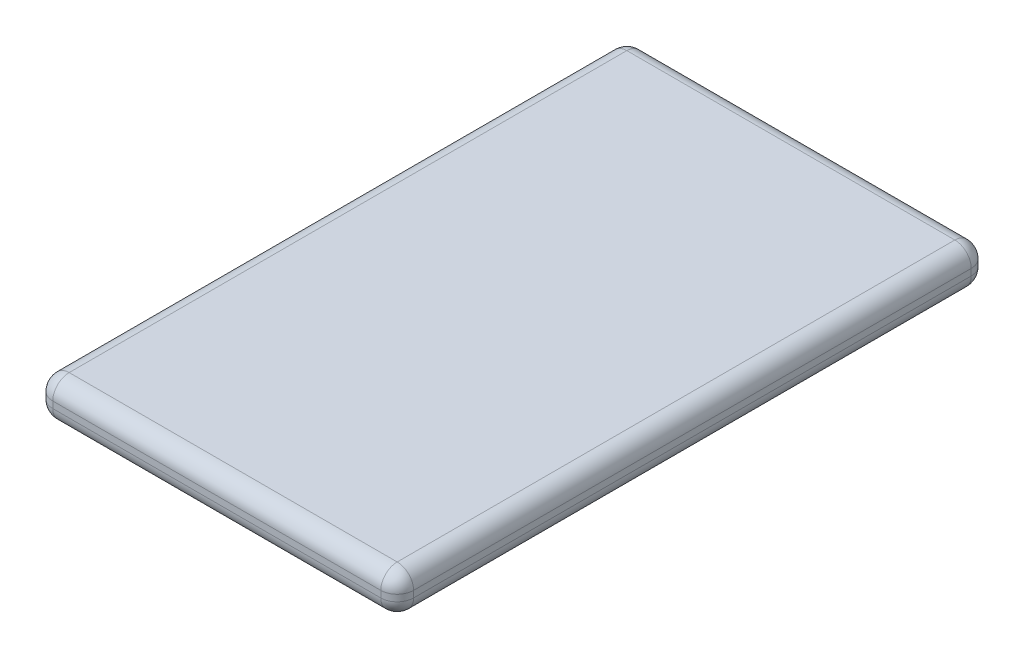
ISO-10303-21;
HEADER;
FILE_DESCRIPTION(('STEP AP214'),'2;1');
FILE_NAME('part.step','',(''),(''),'','','');
FILE_SCHEMA(('AUTOMOTIVE_DESIGN { 1 0 10303 214 1 1 1 1 }'));
ENDSEC;
DATA;
#1=APPLICATION_CONTEXT('core data for automotive mechanical design processes');
#2=APPLICATION_PROTOCOL_DEFINITION('international standard','automotive_design',2000,#1);
#3=PRODUCT_CONTEXT('',#1,'mechanical');
#4=PRODUCT('Part','Part','',(#3));
#5=PRODUCT_RELATED_PRODUCT_CATEGORY('part','',(#4));
#6=PRODUCT_DEFINITION_FORMATION('','',#4);
#7=PRODUCT_DEFINITION_CONTEXT('part definition',#1,'design');
#8=PRODUCT_DEFINITION('design','',#6,#7);
#9=PRODUCT_DEFINITION_SHAPE('','',#8);
#10=(LENGTH_UNIT() NAMED_UNIT(*) SI_UNIT(.MILLI.,.METRE.));
#11=(NAMED_UNIT(*) PLANE_ANGLE_UNIT() SI_UNIT($,.RADIAN.));
#12=(NAMED_UNIT(*) SI_UNIT($,.STERADIAN.) SOLID_ANGLE_UNIT());
#13=UNCERTAINTY_MEASURE_WITH_UNIT(LENGTH_MEASURE(1.E-05),#10,'distance_accuracy_value','');
#14=(GEOMETRIC_REPRESENTATION_CONTEXT(3) GLOBAL_UNCERTAINTY_ASSIGNED_CONTEXT((#13)) GLOBAL_UNIT_ASSIGNED_CONTEXT((#10,
#11,#12)) REPRESENTATION_CONTEXT('',''));
#15=CARTESIAN_POINT('',(0.,0.,0.));
#16=DIRECTION('',(0.,0.,1.));
#17=DIRECTION('',(1.,0.,0.));
#18=AXIS2_PLACEMENT_3D('',#15,#16,#17);
#19=CARTESIAN_POINT('',(0.,6.,0.));
#20=DIRECTION('',(1.,0.,0.));
#21=DIRECTION('',(0.,0.,-1.));
#22=AXIS2_PLACEMENT_3D('',#19,#20,#21);
#23=PLANE('',#22);
#24=DIRECTION('',(0.,-1.,0.));
#25=VECTOR('',#24,1.);
#26=CARTESIAN_POINT('',(0.,6.,2.5));
#27=LINE('',#26,#25);
#28=CARTESIAN_POINT('',(0.,3.5,2.5));
#29=VERTEX_POINT('',#28);
#30=CARTESIAN_POINT('',(0.,2.5,2.5));
#31=VERTEX_POINT('',#30);
#32=EDGE_CURVE('E133',#29,#31,#27,.T.);
#33=ORIENTED_EDGE('',*,*,#32,.T.);
#34=DIRECTION('',(0.,0.,1.));
#35=VECTOR('',#34,1.);
#36=CARTESIAN_POINT('',(0.,2.5,0.));
#37=LINE('',#36,#35);
#38=CARTESIAN_POINT('',(0.,2.5,87.5));
#39=VERTEX_POINT('',#38);
#40=EDGE_CURVE('E129',#31,#39,#37,.T.);
#41=ORIENTED_EDGE('',*,*,#40,.T.);
#42=DIRECTION('',(0.,-1.,0.));
#43=VECTOR('',#42,1.);
#44=CARTESIAN_POINT('',(0.,6.,87.5));
#45=LINE('',#44,#43);
#46=CARTESIAN_POINT('',(0.,3.5,87.5));
#47=VERTEX_POINT('',#46);
#48=EDGE_CURVE('E122',#39,#47,#45,.F.);
#49=ORIENTED_EDGE('',*,*,#48,.T.);
#50=DIRECTION('',(0.,0.,1.));
#51=VECTOR('',#50,1.);
#52=CARTESIAN_POINT('',(0.,3.5,0.));
#53=LINE('',#52,#51);
#54=EDGE_CURVE('E126',#47,#29,#53,.F.);
#55=ORIENTED_EDGE('',*,*,#54,.T.);
#56=EDGE_LOOP('',(#33,#41,#49,#55));
#57=FACE_BOUND('',#56,.T.);
#58=ADVANCED_FACE('F34',(#57),#23,.F.);
#59=CARTESIAN_POINT('',(0.,6.,90.));
#60=DIRECTION('',(0.,0.,-1.));
#61=DIRECTION('',(-1.,0.,0.));
#62=AXIS2_PLACEMENT_3D('',#59,#60,#61);
#63=PLANE('',#62);
#64=DIRECTION('',(0.,-1.,0.));
#65=VECTOR('',#64,1.);
#66=CARTESIAN_POINT('',(2.50000000000001,6.,90.));
#67=LINE('',#66,#65);
#68=CARTESIAN_POINT('',(2.50000000000001,3.5,90.));
#69=VERTEX_POINT('',#68);
#70=CARTESIAN_POINT('',(2.50000000000001,2.5,90.));
#71=VERTEX_POINT('',#70);
#72=EDGE_CURVE('E141',#69,#71,#67,.T.);
#73=ORIENTED_EDGE('',*,*,#72,.T.);
#74=DIRECTION('',(1.,0.,0.));
#75=VECTOR('',#74,1.);
#76=CARTESIAN_POINT('',(0.,2.5,90.));
#77=LINE('',#76,#75);
#78=CARTESIAN_POINT('',(52.5,2.5,90.));
#79=VERTEX_POINT('',#78);
#80=EDGE_CURVE('E179',#71,#79,#77,.T.);
#81=ORIENTED_EDGE('',*,*,#80,.T.);
#82=DIRECTION('',(0.,-1.,0.));
#83=VECTOR('',#82,1.);
#84=CARTESIAN_POINT('',(52.5,6.,90.));
#85=LINE('',#84,#83);
#86=CARTESIAN_POINT('',(52.5,3.5,90.));
#87=VERTEX_POINT('',#86);
#88=EDGE_CURVE('E176',#79,#87,#85,.F.);
#89=ORIENTED_EDGE('',*,*,#88,.T.);
#90=DIRECTION('',(1.,0.,0.));
#91=VECTOR('',#90,1.);
#92=CARTESIAN_POINT('',(0.,3.5,90.));
#93=LINE('',#92,#91);
#94=EDGE_CURVE('E174',#87,#69,#93,.F.);
#95=ORIENTED_EDGE('',*,*,#94,.T.);
#96=EDGE_LOOP('',(#73,#81,#89,#95));
#97=FACE_BOUND('',#96,.T.);
#98=ADVANCED_FACE('F296',(#97),#63,.F.);
#99=CARTESIAN_POINT('',(55.,6.,0.));
#100=DIRECTION('',(-1.,0.,0.));
#101=DIRECTION('',(0.,0.,1.));
#102=AXIS2_PLACEMENT_3D('',#99,#100,#101);
#103=PLANE('',#102);
#104=DIRECTION('',(0.,-1.,0.));
#105=VECTOR('',#104,1.);
#106=CARTESIAN_POINT('',(55.,6.,87.5));
#107=LINE('',#106,#105);
#108=CARTESIAN_POINT('',(55.,3.5,87.5));
#109=VERTEX_POINT('',#108);
#110=CARTESIAN_POINT('',(55.,2.5,87.5));
#111=VERTEX_POINT('',#110);
#112=EDGE_CURVE('E185',#109,#111,#107,.T.);
#113=ORIENTED_EDGE('',*,*,#112,.T.);
#114=DIRECTION('',(0.,0.,-1.));
#115=VECTOR('',#114,1.);
#116=CARTESIAN_POINT('',(55.,2.5,0.));
#117=LINE('',#116,#115);
#118=CARTESIAN_POINT('',(55.,2.5,2.5));
#119=VERTEX_POINT('',#118);
#120=EDGE_CURVE('E188',#111,#119,#117,.T.);
#121=ORIENTED_EDGE('',*,*,#120,.T.);
#122=DIRECTION('',(0.,-1.,0.));
#123=VECTOR('',#122,1.);
#124=CARTESIAN_POINT('',(55.,6.,2.5));
#125=LINE('',#124,#123);
#126=CARTESIAN_POINT('',(55.,3.5,2.5));
#127=VERTEX_POINT('',#126);
#128=EDGE_CURVE('E183',#119,#127,#125,.F.);
#129=ORIENTED_EDGE('',*,*,#128,.T.);
#130=DIRECTION('',(0.,0.,-1.));
#131=VECTOR('',#130,1.);
#132=CARTESIAN_POINT('',(55.,3.5,90.));
#133=LINE('',#132,#131);
#134=EDGE_CURVE('E181',#127,#109,#133,.F.);
#135=ORIENTED_EDGE('',*,*,#134,.T.);
#136=EDGE_LOOP('',(#113,#121,#129,#135));
#137=FACE_BOUND('',#136,.T.);
#138=ADVANCED_FACE('F273',(#137),#103,.F.);
#139=CARTESIAN_POINT('',(0.,6.,0.));
#140=DIRECTION('',(0.,0.,1.));
#141=DIRECTION('',(1.,0.,0.));
#142=AXIS2_PLACEMENT_3D('',#139,#140,#141);
#143=PLANE('',#142);
#144=DIRECTION('',(0.,-1.,0.));
#145=VECTOR('',#144,1.);
#146=CARTESIAN_POINT('',(52.5,6.,0.));
#147=LINE('',#146,#145);
#148=CARTESIAN_POINT('',(52.5,3.5,0.));
#149=VERTEX_POINT('',#148);
#150=CARTESIAN_POINT('',(52.5,2.5,0.));
#151=VERTEX_POINT('',#150);
#152=EDGE_CURVE('E167',#149,#151,#147,.T.);
#153=ORIENTED_EDGE('',*,*,#152,.T.);
#154=DIRECTION('',(-1.,0.,0.));
#155=VECTOR('',#154,1.);
#156=CARTESIAN_POINT('',(0.,2.5,0.));
#157=LINE('',#156,#155);
#158=CARTESIAN_POINT('',(2.5,2.5,0.));
#159=VERTEX_POINT('',#158);
#160=EDGE_CURVE('E172',#151,#159,#157,.T.);
#161=ORIENTED_EDGE('',*,*,#160,.T.);
#162=DIRECTION('',(0.,-1.,0.));
#163=VECTOR('',#162,1.);
#164=CARTESIAN_POINT('',(2.5,6.,0.));
#165=LINE('',#164,#163);
#166=CARTESIAN_POINT('',(2.5,3.5,0.));
#167=VERTEX_POINT('',#166);
#168=EDGE_CURVE('E169',#159,#167,#165,.F.);
#169=ORIENTED_EDGE('',*,*,#168,.T.);
#170=DIRECTION('',(-1.,0.,0.));
#171=VECTOR('',#170,1.);
#172=CARTESIAN_POINT('',(55.,3.5,0.));
#173=LINE('',#172,#171);
#174=EDGE_CURVE('E165',#167,#149,#173,.F.);
#175=ORIENTED_EDGE('',*,*,#174,.T.);
#176=EDGE_LOOP('',(#153,#161,#169,#175));
#177=FACE_BOUND('',#176,.T.);
#178=ADVANCED_FACE('F303',(#177),#143,.F.);
#179=CARTESIAN_POINT('',(0.,6.,0.));
#180=DIRECTION('',(0.,1.,0.));
#181=DIRECTION('',(0.,0.,1.));
#182=AXIS2_PLACEMENT_3D('',#179,#180,#181);
#183=PLANE('',#182);
#184=DIRECTION('',(0.,0.,-1.));
#185=VECTOR('',#184,1.);
#186=CARTESIAN_POINT('',(52.5,6.,0.));
#187=LINE('',#186,#185);
#188=CARTESIAN_POINT('',(52.5,6.,87.5));
#189=VERTEX_POINT('',#188);
#190=CARTESIAN_POINT('',(52.5,6.,2.5));
#191=VERTEX_POINT('',#190);
#192=EDGE_CURVE('E43',#189,#191,#187,.T.);
#193=ORIENTED_EDGE('',*,*,#192,.T.);
#194=DIRECTION('',(-1.,0.,0.));
#195=VECTOR('',#194,1.);
#196=CARTESIAN_POINT('',(0.,6.,2.5));
#197=LINE('',#196,#195);
#198=CARTESIAN_POINT('',(2.5,6.,2.5));
#199=VERTEX_POINT('',#198);
#200=EDGE_CURVE('E11',#191,#199,#197,.T.);
#201=ORIENTED_EDGE('',*,*,#200,.T.);
#202=DIRECTION('',(0.,0.,1.));
#203=VECTOR('',#202,1.);
#204=CARTESIAN_POINT('',(2.50000000000001,6.,90.));
#205=LINE('',#204,#203);
#206=CARTESIAN_POINT('',(2.50000000000001,6.,87.5));
#207=VERTEX_POINT('',#206);
#208=EDGE_CURVE('E199',#199,#207,#205,.T.);
#209=ORIENTED_EDGE('',*,*,#208,.T.);
#210=DIRECTION('',(1.,0.,0.));
#211=VECTOR('',#210,1.);
#212=CARTESIAN_POINT('',(55.,6.,87.5));
#213=LINE('',#212,#211);
#214=EDGE_CURVE('E54',#207,#189,#213,.T.);
#215=ORIENTED_EDGE('',*,*,#214,.T.);
#216=EDGE_LOOP('',(#193,#201,#209,#215));
#217=FACE_BOUND('',#216,.T.);
#218=ADVANCED_FACE('F366',(#217),#183,.T.);
#219=CARTESIAN_POINT('',(0.,0.,0.));
#220=DIRECTION('',(0.,1.,0.));
#221=DIRECTION('',(0.,0.,1.));
#222=AXIS2_PLACEMENT_3D('',#219,#220,#221);
#223=PLANE('',#222);
#224=DIRECTION('',(0.,0.,-1.));
#225=VECTOR('',#224,1.);
#226=CARTESIAN_POINT('',(52.5,0.,0.));
#227=LINE('',#226,#225);
#228=CARTESIAN_POINT('',(52.5,0.,2.5));
#229=VERTEX_POINT('',#228);
#230=CARTESIAN_POINT('',(52.5,0.,87.5));
#231=VERTEX_POINT('',#230);
#232=EDGE_CURVE('E194',#229,#231,#227,.F.);
#233=ORIENTED_EDGE('',*,*,#232,.T.);
#234=DIRECTION('',(1.,0.,0.));
#235=VECTOR('',#234,1.);
#236=CARTESIAN_POINT('',(0.,0.,87.5));
#237=LINE('',#236,#235);
#238=CARTESIAN_POINT('',(2.50000000000001,0.,87.5));
#239=VERTEX_POINT('',#238);
#240=EDGE_CURVE('E196',#231,#239,#237,.F.);
#241=ORIENTED_EDGE('',*,*,#240,.T.);
#242=DIRECTION('',(0.,0.,1.));
#243=VECTOR('',#242,1.);
#244=CARTESIAN_POINT('',(2.5,0.,0.));
#245=LINE('',#244,#243);
#246=CARTESIAN_POINT('',(2.5,0.,2.5));
#247=VERTEX_POINT('',#246);
#248=EDGE_CURVE('E190',#239,#247,#245,.F.);
#249=ORIENTED_EDGE('',*,*,#248,.T.);
#250=DIRECTION('',(-1.,0.,0.));
#251=VECTOR('',#250,1.);
#252=CARTESIAN_POINT('',(0.,0.,2.5));
#253=LINE('',#252,#251);
#254=EDGE_CURVE('E192',#247,#229,#253,.F.);
#255=ORIENTED_EDGE('',*,*,#254,.T.);
#256=EDGE_LOOP('',(#233,#241,#249,#255));
#257=FACE_BOUND('',#256,.T.);
#258=ADVANCED_FACE('F265',(#257),#223,.F.);
#259=CARTESIAN_POINT('',(52.5,6.,87.5));
#260=DIRECTION('',(0.,-1.,0.));
#261=DIRECTION('',(0.,0.,-1.));
#262=AXIS2_PLACEMENT_3D('',#259,#260,#261);
#263=CYLINDRICAL_SURFACE('',#262,2.5);
#264=CARTESIAN_POINT('',(52.5,3.5,87.5));
#265=DIRECTION('',(0.,1.,0.));
#266=DIRECTION('',(0.,0.,1.));
#267=AXIS2_PLACEMENT_3D('',#264,#265,#266);
#268=CIRCLE('',#267,2.5);
#269=EDGE_CURVE('E38',#87,#109,#268,.T.);
#270=ORIENTED_EDGE('',*,*,#269,.F.);
#271=ORIENTED_EDGE('',*,*,#88,.F.);
#272=CARTESIAN_POINT('',(52.5,2.5,87.5));
#273=DIRECTION('',(0.,-1.,0.));
#274=DIRECTION('',(0.,0.,-1.));
#275=AXIS2_PLACEMENT_3D('',#272,#273,#274);
#276=CIRCLE('',#275,2.5);
#277=EDGE_CURVE('E161',#111,#79,#276,.T.);
#278=ORIENTED_EDGE('',*,*,#277,.F.);
#279=ORIENTED_EDGE('',*,*,#112,.F.);
#280=EDGE_LOOP('',(#270,#271,#278,#279));
#281=FACE_BOUND('',#280,.T.);
#282=ADVANCED_FACE('F36',(#281),#263,.T.);
#283=CARTESIAN_POINT('',(52.5,3.5,87.5));
#284=DIRECTION('',(0.,0.,1.));
#285=DIRECTION('',(1.,0.,0.));
#286=AXIS2_PLACEMENT_3D('',#283,#284,#285);
#287=SPHERICAL_SURFACE('',#286,2.5);
#288=CARTESIAN_POINT('',(52.5,3.5,87.5));
#289=DIRECTION('',(1.,0.,0.));
#290=DIRECTION('',(0.,0.,-1.));
#291=AXIS2_PLACEMENT_3D('',#288,#289,#290);
#292=CIRCLE('',#291,2.5);
#293=EDGE_CURVE('E246',#87,#189,#292,.F.);
#294=ORIENTED_EDGE('',*,*,#293,.F.);
#295=ORIENTED_EDGE('',*,*,#269,.T.);
#296=CARTESIAN_POINT('',(52.5,3.5,87.5));
#297=DIRECTION('',(0.,0.,1.));
#298=DIRECTION('',(1.,0.,0.));
#299=AXIS2_PLACEMENT_3D('',#296,#297,#298);
#300=CIRCLE('',#299,2.5);
#301=EDGE_CURVE('E248',#189,#109,#300,.F.);
#302=ORIENTED_EDGE('',*,*,#301,.F.);
#303=EDGE_LOOP('',(#294,#295,#302));
#304=FACE_BOUND('',#303,.T.);
#305=ADVANCED_FACE('F291',(#304),#287,.T.);
#306=CARTESIAN_POINT('',(52.5,2.5,87.5));
#307=DIRECTION('',(0.,0.,1.));
#308=DIRECTION('',(1.,0.,0.));
#309=AXIS2_PLACEMENT_3D('',#306,#307,#308);
#310=SPHERICAL_SURFACE('',#309,2.5);
#311=CARTESIAN_POINT('',(52.5,2.5,87.5));
#312=DIRECTION('',(0.,0.,1.));
#313=DIRECTION('',(1.,0.,0.));
#314=AXIS2_PLACEMENT_3D('',#311,#312,#313);
#315=CIRCLE('',#314,2.5);
#316=EDGE_CURVE('E240',#111,#231,#315,.F.);
#317=ORIENTED_EDGE('',*,*,#316,.F.);
#318=ORIENTED_EDGE('',*,*,#277,.T.);
#319=CARTESIAN_POINT('',(52.5,2.5,87.5));
#320=DIRECTION('',(1.,0.,0.));
#321=DIRECTION('',(0.,0.,-1.));
#322=AXIS2_PLACEMENT_3D('',#319,#320,#321);
#323=CIRCLE('',#322,2.5);
#324=EDGE_CURVE('E243',#231,#79,#323,.F.);
#325=ORIENTED_EDGE('',*,*,#324,.F.);
#326=EDGE_LOOP('',(#317,#318,#325));
#327=FACE_BOUND('',#326,.T.);
#328=ADVANCED_FACE('F255',(#327),#310,.T.);
#329=CARTESIAN_POINT('',(52.5,3.5,0.));
#330=DIRECTION('',(0.,0.,1.));
#331=DIRECTION('',(1.,0.,0.));
#332=AXIS2_PLACEMENT_3D('',#329,#330,#331);
#333=CYLINDRICAL_SURFACE('',#332,2.5);
#334=ORIENTED_EDGE('',*,*,#301,.T.);
#335=ORIENTED_EDGE('',*,*,#134,.F.);
#336=CARTESIAN_POINT('',(52.5,3.5,2.5));
#337=DIRECTION('',(0.,0.,-1.));
#338=DIRECTION('',(-1.,0.,0.));
#339=AXIS2_PLACEMENT_3D('',#336,#337,#338);
#340=CIRCLE('',#339,2.5);
#341=EDGE_CURVE('E234',#191,#127,#340,.T.);
#342=ORIENTED_EDGE('',*,*,#341,.F.);
#343=ORIENTED_EDGE('',*,*,#192,.F.);
#344=EDGE_LOOP('',(#334,#335,#342,#343));
#345=FACE_BOUND('',#344,.T.);
#346=ADVANCED_FACE('F286',(#345),#333,.T.);
#347=CARTESIAN_POINT('',(0.,3.5,87.5));
#348=DIRECTION('',(-1.,0.,0.));
#349=DIRECTION('',(0.,0.,1.));
#350=AXIS2_PLACEMENT_3D('',#347,#348,#349);
#351=CYLINDRICAL_SURFACE('',#350,2.5);
#352=ORIENTED_EDGE('',*,*,#293,.T.);
#353=ORIENTED_EDGE('',*,*,#214,.F.);
#354=CARTESIAN_POINT('',(2.50000000000001,3.5,87.5));
#355=DIRECTION('',(-1.,0.,0.));
#356=DIRECTION('',(0.,-1.,0.));
#357=AXIS2_PLACEMENT_3D('',#354,#355,#356);
#358=CIRCLE('',#357,2.5);
#359=EDGE_CURVE('E145',#69,#207,#358,.T.);
#360=ORIENTED_EDGE('',*,*,#359,.F.);
#361=ORIENTED_EDGE('',*,*,#94,.F.);
#362=EDGE_LOOP('',(#352,#353,#360,#361));
#363=FACE_BOUND('',#362,.T.);
#364=ADVANCED_FACE('F294',(#363),#351,.T.);
#365=CARTESIAN_POINT('',(2.50000000000001,6.,87.5));
#366=DIRECTION('',(0.,-1.,0.));
#367=DIRECTION('',(0.,0.,-1.));
#368=AXIS2_PLACEMENT_3D('',#365,#366,#367);
#369=CYLINDRICAL_SURFACE('',#368,2.5);
#370=CARTESIAN_POINT('',(2.50000000000001,2.5,87.5));
#371=DIRECTION('',(0.,-1.,0.));
#372=DIRECTION('',(0.,0.,-1.));
#373=AXIS2_PLACEMENT_3D('',#370,#371,#372);
#374=CIRCLE('',#373,2.5);
#375=EDGE_CURVE('E146',#71,#39,#374,.T.);
#376=ORIENTED_EDGE('',*,*,#375,.F.);
#377=ORIENTED_EDGE('',*,*,#72,.F.);
#378=CARTESIAN_POINT('',(2.50000000000001,3.5,87.5));
#379=DIRECTION('',(0.,1.,0.));
#380=DIRECTION('',(0.,0.,1.));
#381=AXIS2_PLACEMENT_3D('',#378,#379,#380);
#382=CIRCLE('',#381,2.5);
#383=EDGE_CURVE('E137',#47,#69,#382,.T.);
#384=ORIENTED_EDGE('',*,*,#383,.F.);
#385=ORIENTED_EDGE('',*,*,#48,.F.);
#386=EDGE_LOOP('',(#376,#377,#384,#385));
#387=FACE_BOUND('',#386,.T.);
#388=ADVANCED_FACE('F139',(#387),#369,.T.);
#389=CARTESIAN_POINT('',(0.,2.5,87.5));
#390=DIRECTION('',(1.,0.,0.));
#391=DIRECTION('',(0.,0.,-1.));
#392=AXIS2_PLACEMENT_3D('',#389,#390,#391);
#393=CYLINDRICAL_SURFACE('',#392,2.5);
#394=ORIENTED_EDGE('',*,*,#324,.T.);
#395=ORIENTED_EDGE('',*,*,#80,.F.);
#396=CARTESIAN_POINT('',(2.50000000000001,2.5,87.5));
#397=DIRECTION('',(-1.,0.,0.));
#398=DIRECTION('',(0.,0.,1.));
#399=AXIS2_PLACEMENT_3D('',#396,#397,#398);
#400=CIRCLE('',#399,2.5);
#401=EDGE_CURVE('E230',#239,#71,#400,.T.);
#402=ORIENTED_EDGE('',*,*,#401,.F.);
#403=ORIENTED_EDGE('',*,*,#240,.F.);
#404=EDGE_LOOP('',(#394,#395,#402,#403));
#405=FACE_BOUND('',#404,.T.);
#406=ADVANCED_FACE('F262',(#405),#393,.T.);
#407=CARTESIAN_POINT('',(52.5,2.5,0.));
#408=DIRECTION('',(0.,0.,-1.));
#409=DIRECTION('',(-1.,0.,0.));
#410=AXIS2_PLACEMENT_3D('',#407,#408,#409);
#411=CYLINDRICAL_SURFACE('',#410,2.5);
#412=ORIENTED_EDGE('',*,*,#316,.T.);
#413=ORIENTED_EDGE('',*,*,#232,.F.);
#414=CARTESIAN_POINT('',(52.5,2.5,2.5));
#415=DIRECTION('',(0.,0.,-1.));
#416=DIRECTION('',(-1.,0.,0.));
#417=AXIS2_PLACEMENT_3D('',#414,#415,#416);
#418=CIRCLE('',#417,2.5);
#419=EDGE_CURVE('E227',#119,#229,#418,.T.);
#420=ORIENTED_EDGE('',*,*,#419,.F.);
#421=ORIENTED_EDGE('',*,*,#120,.F.);
#422=EDGE_LOOP('',(#412,#413,#420,#421));
#423=FACE_BOUND('',#422,.T.);
#424=ADVANCED_FACE('F270',(#423),#411,.T.);
#425=CARTESIAN_POINT('',(52.5,6.,2.5));
#426=DIRECTION('',(0.,-1.,0.));
#427=DIRECTION('',(0.,0.,-1.));
#428=AXIS2_PLACEMENT_3D('',#425,#426,#427);
#429=CYLINDRICAL_SURFACE('',#428,2.5);
#430=CARTESIAN_POINT('',(52.5,3.5,2.5));
#431=DIRECTION('',(0.,1.,0.));
#432=DIRECTION('',(0.,0.,1.));
#433=AXIS2_PLACEMENT_3D('',#430,#431,#432);
#434=CIRCLE('',#433,2.5);
#435=EDGE_CURVE('E237',#127,#149,#434,.T.);
#436=ORIENTED_EDGE('',*,*,#435,.F.);
#437=ORIENTED_EDGE('',*,*,#128,.F.);
#438=CARTESIAN_POINT('',(52.5,2.5,2.5));
#439=DIRECTION('',(0.,-1.,0.));
#440=DIRECTION('',(0.,0.,-1.));
#441=AXIS2_PLACEMENT_3D('',#438,#439,#440);
#442=CIRCLE('',#441,2.5);
#443=EDGE_CURVE('E224',#151,#119,#442,.T.);
#444=ORIENTED_EDGE('',*,*,#443,.F.);
#445=ORIENTED_EDGE('',*,*,#152,.F.);
#446=EDGE_LOOP('',(#436,#437,#444,#445));
#447=FACE_BOUND('',#446,.T.);
#448=ADVANCED_FACE('F278',(#447),#429,.T.);
#449=CARTESIAN_POINT('',(52.5,3.5,2.5));
#450=DIRECTION('',(0.,0.,1.));
#451=DIRECTION('',(1.,0.,0.));
#452=AXIS2_PLACEMENT_3D('',#449,#450,#451);
#453=SPHERICAL_SURFACE('',#452,2.5);
#454=ORIENTED_EDGE('',*,*,#341,.T.);
#455=ORIENTED_EDGE('',*,*,#435,.T.);
#456=CARTESIAN_POINT('',(52.5,3.5,2.5));
#457=DIRECTION('',(1.,0.,0.));
#458=DIRECTION('',(0.,0.,-1.));
#459=AXIS2_PLACEMENT_3D('',#456,#457,#458);
#460=CIRCLE('',#459,2.5);
#461=EDGE_CURVE('E153',#191,#149,#460,.F.);
#462=ORIENTED_EDGE('',*,*,#461,.F.);
#463=EDGE_LOOP('',(#454,#455,#462));
#464=FACE_BOUND('',#463,.T.);
#465=ADVANCED_FACE('F283',(#464),#453,.T.);
#466=CARTESIAN_POINT('',(2.50000000000001,3.5,87.5));
#467=DIRECTION('',(0.,0.,1.));
#468=DIRECTION('',(1.,0.,0.));
#469=AXIS2_PLACEMENT_3D('',#466,#467,#468);
#470=SPHERICAL_SURFACE('',#469,2.5);
#471=ORIENTED_EDGE('',*,*,#383,.T.);
#472=ORIENTED_EDGE('',*,*,#359,.T.);
#473=CARTESIAN_POINT('',(2.50000000000001,3.5,87.5));
#474=DIRECTION('',(0.,0.,1.));
#475=DIRECTION('',(1.,0.,0.));
#476=AXIS2_PLACEMENT_3D('',#473,#474,#475);
#477=CIRCLE('',#476,2.5);
#478=EDGE_CURVE('E149',#47,#207,#477,.F.);
#479=ORIENTED_EDGE('',*,*,#478,.F.);
#480=EDGE_LOOP('',(#471,#472,#479));
#481=FACE_BOUND('',#480,.T.);
#482=ADVANCED_FACE('F150',(#481),#470,.T.);
#483=CARTESIAN_POINT('',(2.50000000000001,2.5,87.5));
#484=DIRECTION('',(0.,0.,1.));
#485=DIRECTION('',(1.,0.,0.));
#486=AXIS2_PLACEMENT_3D('',#483,#484,#485);
#487=SPHERICAL_SURFACE('',#486,2.5);
#488=ORIENTED_EDGE('',*,*,#401,.T.);
#489=ORIENTED_EDGE('',*,*,#375,.T.);
#490=CARTESIAN_POINT('',(2.50000000000001,2.5,87.5));
#491=DIRECTION('',(0.,0.,1.));
#492=DIRECTION('',(1.,0.,0.));
#493=AXIS2_PLACEMENT_3D('',#490,#491,#492);
#494=CIRCLE('',#493,2.5);
#495=EDGE_CURVE('E154',#239,#39,#494,.F.);
#496=ORIENTED_EDGE('',*,*,#495,.F.);
#497=EDGE_LOOP('',(#488,#489,#496));
#498=FACE_BOUND('',#497,.T.);
#499=ADVANCED_FACE('F337',(#498),#487,.T.);
#500=CARTESIAN_POINT('',(52.5,2.5,2.5));
#501=DIRECTION('',(0.,0.,1.));
#502=DIRECTION('',(1.,0.,0.));
#503=AXIS2_PLACEMENT_3D('',#500,#501,#502);
#504=SPHERICAL_SURFACE('',#503,2.5);
#505=ORIENTED_EDGE('',*,*,#443,.T.);
#506=ORIENTED_EDGE('',*,*,#419,.T.);
#507=CARTESIAN_POINT('',(52.5,2.5,2.5));
#508=DIRECTION('',(1.,0.,0.));
#509=DIRECTION('',(0.,0.,-1.));
#510=AXIS2_PLACEMENT_3D('',#507,#508,#509);
#511=CIRCLE('',#510,2.5);
#512=EDGE_CURVE('E217',#151,#229,#511,.F.);
#513=ORIENTED_EDGE('',*,*,#512,.F.);
#514=EDGE_LOOP('',(#505,#506,#513));
#515=FACE_BOUND('',#514,.T.);
#516=ADVANCED_FACE('F333',(#515),#504,.T.);
#517=CARTESIAN_POINT('',(0.,3.5,2.5));
#518=DIRECTION('',(1.,0.,0.));
#519=DIRECTION('',(0.,0.,-1.));
#520=AXIS2_PLACEMENT_3D('',#517,#518,#519);
#521=CYLINDRICAL_SURFACE('',#520,2.5);
#522=ORIENTED_EDGE('',*,*,#461,.T.);
#523=ORIENTED_EDGE('',*,*,#174,.F.);
#524=CARTESIAN_POINT('',(2.5,3.5,2.5));
#525=DIRECTION('',(-1.,0.,0.));
#526=DIRECTION('',(0.,0.,1.));
#527=AXIS2_PLACEMENT_3D('',#524,#525,#526);
#528=CIRCLE('',#527,2.5);
#529=EDGE_CURVE('E214',#199,#167,#528,.T.);
#530=ORIENTED_EDGE('',*,*,#529,.F.);
#531=ORIENTED_EDGE('',*,*,#200,.F.);
#532=EDGE_LOOP('',(#522,#523,#530,#531));
#533=FACE_BOUND('',#532,.T.);
#534=ADVANCED_FACE('F330',(#533),#521,.T.);
#535=CARTESIAN_POINT('',(2.5,3.5,0.));
#536=DIRECTION('',(0.,0.,-1.));
#537=DIRECTION('',(-1.,0.,0.));
#538=AXIS2_PLACEMENT_3D('',#535,#536,#537);
#539=CYLINDRICAL_SURFACE('',#538,2.5);
#540=ORIENTED_EDGE('',*,*,#478,.T.);
#541=ORIENTED_EDGE('',*,*,#208,.F.);
#542=CARTESIAN_POINT('',(2.5,3.5,2.5));
#543=DIRECTION('',(0.,0.,-1.));
#544=DIRECTION('',(-1.,0.,0.));
#545=AXIS2_PLACEMENT_3D('',#542,#543,#544);
#546=CIRCLE('',#545,2.5);
#547=EDGE_CURVE('E157',#29,#199,#546,.T.);
#548=ORIENTED_EDGE('',*,*,#547,.F.);
#549=ORIENTED_EDGE('',*,*,#54,.F.);
#550=EDGE_LOOP('',(#540,#541,#548,#549));
#551=FACE_BOUND('',#550,.T.);
#552=ADVANCED_FACE('F156',(#551),#539,.T.);
#553=CARTESIAN_POINT('',(2.5,2.5,0.));
#554=DIRECTION('',(0.,0.,1.));
#555=DIRECTION('',(1.,0.,0.));
#556=AXIS2_PLACEMENT_3D('',#553,#554,#555);
#557=CYLINDRICAL_SURFACE('',#556,2.5);
#558=ORIENTED_EDGE('',*,*,#495,.T.);
#559=ORIENTED_EDGE('',*,*,#40,.F.);
#560=CARTESIAN_POINT('',(2.5,2.5,2.5));
#561=DIRECTION('',(0.,0.,-1.));
#562=DIRECTION('',(-1.,0.,0.));
#563=AXIS2_PLACEMENT_3D('',#560,#561,#562);
#564=CIRCLE('',#563,2.5);
#565=EDGE_CURVE('E210',#247,#31,#564,.T.);
#566=ORIENTED_EDGE('',*,*,#565,.F.);
#567=ORIENTED_EDGE('',*,*,#248,.F.);
#568=EDGE_LOOP('',(#558,#559,#566,#567));
#569=FACE_BOUND('',#568,.T.);
#570=ADVANCED_FACE('F323',(#569),#557,.T.);
#571=CARTESIAN_POINT('',(0.,2.5,2.5));
#572=DIRECTION('',(-1.,0.,0.));
#573=DIRECTION('',(0.,0.,1.));
#574=AXIS2_PLACEMENT_3D('',#571,#572,#573);
#575=CYLINDRICAL_SURFACE('',#574,2.5);
#576=ORIENTED_EDGE('',*,*,#512,.T.);
#577=ORIENTED_EDGE('',*,*,#254,.F.);
#578=CARTESIAN_POINT('',(2.5,2.5,2.5));
#579=DIRECTION('',(-1.,0.,0.));
#580=DIRECTION('',(0.,0.,1.));
#581=AXIS2_PLACEMENT_3D('',#578,#579,#580);
#582=CIRCLE('',#581,2.5);
#583=EDGE_CURVE('E207',#159,#247,#582,.T.);
#584=ORIENTED_EDGE('',*,*,#583,.F.);
#585=ORIENTED_EDGE('',*,*,#160,.F.);
#586=EDGE_LOOP('',(#576,#577,#584,#585));
#587=FACE_BOUND('',#586,.T.);
#588=ADVANCED_FACE('F319',(#587),#575,.T.);
#589=CARTESIAN_POINT('',(2.5,3.5,2.5));
#590=DIRECTION('',(0.,0.,1.));
#591=DIRECTION('',(1.,0.,0.));
#592=AXIS2_PLACEMENT_3D('',#589,#590,#591);
#593=SPHERICAL_SURFACE('',#592,2.5);
#594=ORIENTED_EDGE('',*,*,#547,.T.);
#595=ORIENTED_EDGE('',*,*,#529,.T.);
#596=CARTESIAN_POINT('',(2.5,3.5,2.5));
#597=DIRECTION('',(0.,1.,0.));
#598=DIRECTION('',(0.,0.,1.));
#599=AXIS2_PLACEMENT_3D('',#596,#597,#598);
#600=CIRCLE('',#599,2.5);
#601=EDGE_CURVE('E205',#29,#167,#600,.F.);
#602=ORIENTED_EDGE('',*,*,#601,.F.);
#603=EDGE_LOOP('',(#594,#595,#602));
#604=FACE_BOUND('',#603,.T.);
#605=ADVANCED_FACE('F315',(#604),#593,.T.);
#606=CARTESIAN_POINT('',(2.5,2.5,2.5));
#607=DIRECTION('',(0.,0.,1.));
#608=DIRECTION('',(1.,0.,0.));
#609=AXIS2_PLACEMENT_3D('',#606,#607,#608);
#610=SPHERICAL_SURFACE('',#609,2.5);
#611=ORIENTED_EDGE('',*,*,#583,.T.);
#612=ORIENTED_EDGE('',*,*,#565,.T.);
#613=CARTESIAN_POINT('',(2.5,2.5,2.5));
#614=DIRECTION('',(0.,-1.,0.));
#615=DIRECTION('',(0.,0.,-1.));
#616=AXIS2_PLACEMENT_3D('',#613,#614,#615);
#617=CIRCLE('',#616,2.5);
#618=EDGE_CURVE('E203',#159,#31,#617,.F.);
#619=ORIENTED_EDGE('',*,*,#618,.F.);
#620=EDGE_LOOP('',(#611,#612,#619));
#621=FACE_BOUND('',#620,.T.);
#622=ADVANCED_FACE('F311',(#621),#610,.T.);
#623=CARTESIAN_POINT('',(2.5,6.,2.5));
#624=DIRECTION('',(0.,-1.,0.));
#625=DIRECTION('',(0.,0.,-1.));
#626=AXIS2_PLACEMENT_3D('',#623,#624,#625);
#627=CYLINDRICAL_SURFACE('',#626,2.5);
#628=ORIENTED_EDGE('',*,*,#601,.T.);
#629=ORIENTED_EDGE('',*,*,#168,.F.);
#630=ORIENTED_EDGE('',*,*,#618,.T.);
#631=ORIENTED_EDGE('',*,*,#32,.F.);
#632=EDGE_LOOP('',(#628,#629,#630,#631));
#633=FACE_BOUND('',#632,.T.);
#634=ADVANCED_FACE('F308',(#633),#627,.T.);
#635=CLOSED_SHELL('',(#58,#98,#138,#178,#218,#258,#282,#305,#328,#346,#364,#388,#406,#424,#448,
#465,#482,#499,#516,#534,#552,#570,#588,#605,#622,#634));
#636=MANIFOLD_SOLID_BREP('B2',#635);
#637=ADVANCED_BREP_SHAPE_REPRESENTATION('',(#18,#636),#14);
#638=SHAPE_DEFINITION_REPRESENTATION(#9,#637);
ENDSEC;
END-ISO-10303-21;
